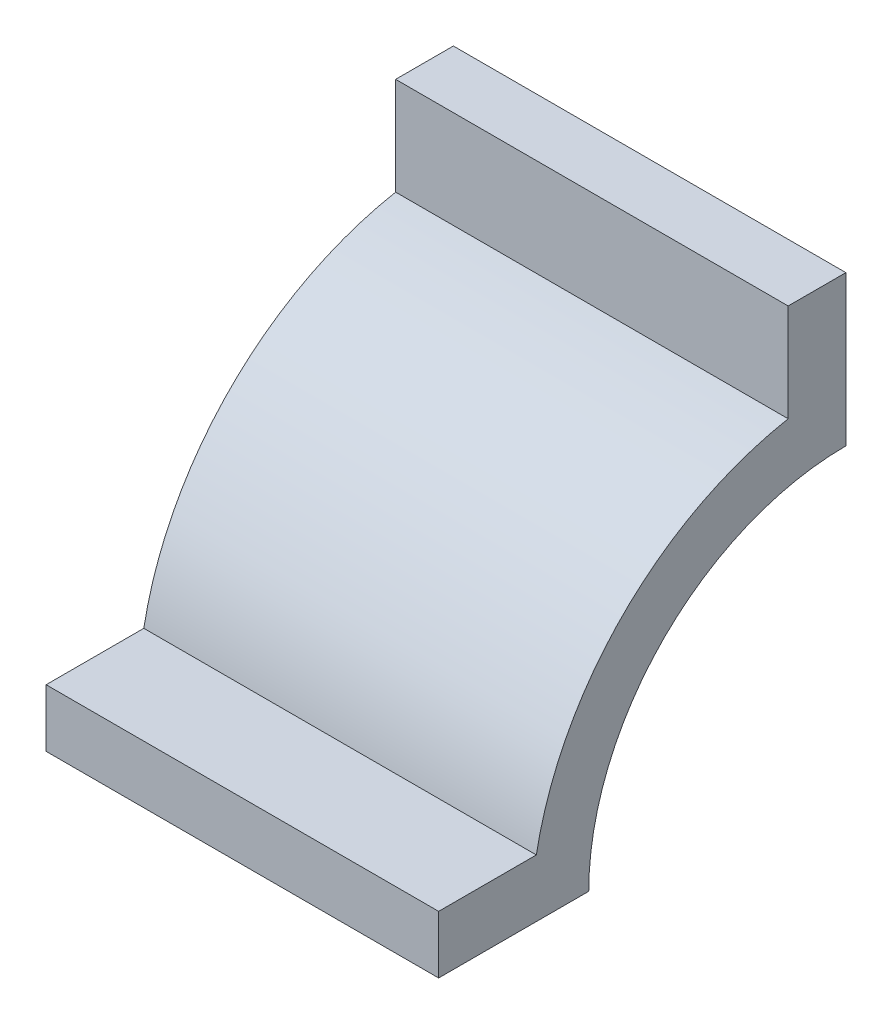
ISO-10303-21;
HEADER;
FILE_DESCRIPTION(('STEP AP214'),'2;1');
FILE_NAME('part.step','',(''),(''),'','','');
FILE_SCHEMA(('AUTOMOTIVE_DESIGN { 1 0 10303 214 1 1 1 1 }'));
ENDSEC;
DATA;
#1=APPLICATION_CONTEXT('core data for automotive mechanical design processes');
#2=APPLICATION_PROTOCOL_DEFINITION('international standard','automotive_design',2000,#1);
#3=PRODUCT_CONTEXT('',#1,'mechanical');
#4=PRODUCT('Part','Part','',(#3));
#5=PRODUCT_RELATED_PRODUCT_CATEGORY('part','',(#4));
#6=PRODUCT_DEFINITION_FORMATION('','',#4);
#7=PRODUCT_DEFINITION_CONTEXT('part definition',#1,'design');
#8=PRODUCT_DEFINITION('design','',#6,#7);
#9=PRODUCT_DEFINITION_SHAPE('','',#8);
#10=(LENGTH_UNIT() NAMED_UNIT(*) SI_UNIT(.MILLI.,.METRE.));
#11=(NAMED_UNIT(*) PLANE_ANGLE_UNIT() SI_UNIT($,.RADIAN.));
#12=(NAMED_UNIT(*) SI_UNIT($,.STERADIAN.) SOLID_ANGLE_UNIT());
#13=UNCERTAINTY_MEASURE_WITH_UNIT(LENGTH_MEASURE(1.E-05),#10,'distance_accuracy_value','');
#14=(GEOMETRIC_REPRESENTATION_CONTEXT(3) GLOBAL_UNCERTAINTY_ASSIGNED_CONTEXT((#13)) GLOBAL_UNIT_ASSIGNED_CONTEXT((#10,
#11,#12)) REPRESENTATION_CONTEXT('',''));
#15=CARTESIAN_POINT('',(0.,0.,0.));
#16=DIRECTION('',(0.,0.,1.));
#17=DIRECTION('',(1.,0.,0.));
#18=AXIS2_PLACEMENT_3D('',#15,#16,#17);
#19=CARTESIAN_POINT('',(34.,0.,0.));
#20=DIRECTION('',(-1.,0.,0.));
#21=DIRECTION('',(0.,0.,1.));
#22=AXIS2_PLACEMENT_3D('',#19,#20,#21);
#23=CYLINDRICAL_SURFACE('',#22,22.275);
#24=CARTESIAN_POINT('',(0.,0.,0.));
#25=DIRECTION('',(-1.,0.,0.));
#26=DIRECTION('',(0.,0.,1.));
#27=AXIS2_PLACEMENT_3D('',#24,#25,#26);
#28=CIRCLE('',#27,22.275);
#29=CARTESIAN_POINT('',(0.,0.,22.275));
#30=VERTEX_POINT('',#29);
#31=CARTESIAN_POINT('',(0.,22.275,0.));
#32=VERTEX_POINT('',#31);
#33=EDGE_CURVE('E135',#30,#32,#28,.T.);
#34=ORIENTED_EDGE('',*,*,#33,.T.);
#35=DIRECTION('',(-1.,0.,0.));
#36=VECTOR('',#35,1.);
#37=CARTESIAN_POINT('',(34.,22.275,0.));
#38=LINE('',#37,#36);
#39=CARTESIAN_POINT('',(34.,22.275,0.));
#40=VERTEX_POINT('',#39);
#41=EDGE_CURVE('E11',#40,#32,#38,.T.);
#42=ORIENTED_EDGE('',*,*,#41,.F.);
#43=CARTESIAN_POINT('',(34.,0.,0.));
#44=DIRECTION('',(-1.,0.,0.));
#45=DIRECTION('',(0.,0.,1.));
#46=AXIS2_PLACEMENT_3D('',#43,#44,#45);
#47=CIRCLE('',#46,22.275);
#48=CARTESIAN_POINT('',(34.,0.,22.275));
#49=VERTEX_POINT('',#48);
#50=EDGE_CURVE('E149',#49,#40,#47,.T.);
#51=ORIENTED_EDGE('',*,*,#50,.F.);
#52=DIRECTION('',(-1.,0.,0.));
#53=VECTOR('',#52,1.);
#54=CARTESIAN_POINT('',(34.,0.,22.275));
#55=LINE('',#54,#53);
#56=EDGE_CURVE('E131',#49,#30,#55,.T.);
#57=ORIENTED_EDGE('',*,*,#56,.T.);
#58=EDGE_LOOP('',(#34,#42,#51,#57));
#59=FACE_BOUND('',#58,.T.);
#60=ADVANCED_FACE('F39',(#59),#23,.F.);
#61=CARTESIAN_POINT('',(34.,22.275,0.));
#62=DIRECTION('',(0.,0.,1.));
#63=DIRECTION('',(1.,0.,0.));
#64=AXIS2_PLACEMENT_3D('',#61,#62,#63);
#65=PLANE('',#64);
#66=DIRECTION('',(0.,1.,0.));
#67=VECTOR('',#66,1.);
#68=CARTESIAN_POINT('',(0.,22.275,0.));
#69=LINE('',#68,#67);
#70=CARTESIAN_POINT('',(0.,35.275,0.));
#71=VERTEX_POINT('',#70);
#72=EDGE_CURVE('E138',#32,#71,#69,.T.);
#73=ORIENTED_EDGE('',*,*,#72,.T.);
#74=DIRECTION('',(-1.,0.,0.));
#75=VECTOR('',#74,1.);
#76=CARTESIAN_POINT('',(34.,35.275,0.));
#77=LINE('',#76,#75);
#78=CARTESIAN_POINT('',(34.,35.275,0.));
#79=VERTEX_POINT('',#78);
#80=EDGE_CURVE('E47',#79,#71,#77,.T.);
#81=ORIENTED_EDGE('',*,*,#80,.F.);
#82=DIRECTION('',(0.,1.,0.));
#83=VECTOR('',#82,1.);
#84=CARTESIAN_POINT('',(34.,22.275,0.));
#85=LINE('',#84,#83);
#86=EDGE_CURVE('E98',#40,#79,#85,.T.);
#87=ORIENTED_EDGE('',*,*,#86,.F.);
#88=ORIENTED_EDGE('',*,*,#41,.T.);
#89=EDGE_LOOP('',(#73,#81,#87,#88));
#90=FACE_BOUND('',#89,.T.);
#91=ADVANCED_FACE('F184',(#90),#65,.F.);
#92=CARTESIAN_POINT('',(34.,35.275,0.));
#93=DIRECTION('',(0.,-1.,0.));
#94=DIRECTION('',(0.,0.,-1.));
#95=AXIS2_PLACEMENT_3D('',#92,#93,#94);
#96=PLANE('',#95);
#97=DIRECTION('',(0.,0.,1.));
#98=VECTOR('',#97,1.);
#99=CARTESIAN_POINT('',(0.,35.275,0.));
#100=LINE('',#99,#98);
#101=CARTESIAN_POINT('',(0.,35.275,5.));
#102=VERTEX_POINT('',#101);
#103=EDGE_CURVE('E140',#71,#102,#100,.T.);
#104=ORIENTED_EDGE('',*,*,#103,.T.);
#105=DIRECTION('',(-1.,0.,0.));
#106=VECTOR('',#105,1.);
#107=CARTESIAN_POINT('',(34.,35.275,5.));
#108=LINE('',#107,#106);
#109=CARTESIAN_POINT('',(34.,35.275,5.));
#110=VERTEX_POINT('',#109);
#111=EDGE_CURVE('E156',#110,#102,#108,.T.);
#112=ORIENTED_EDGE('',*,*,#111,.F.);
#113=DIRECTION('',(0.,0.,1.));
#114=VECTOR('',#113,1.);
#115=CARTESIAN_POINT('',(34.,35.275,0.));
#116=LINE('',#115,#114);
#117=EDGE_CURVE('E164',#79,#110,#116,.T.);
#118=ORIENTED_EDGE('',*,*,#117,.F.);
#119=ORIENTED_EDGE('',*,*,#80,.T.);
#120=EDGE_LOOP('',(#104,#112,#118,#119));
#121=FACE_BOUND('',#120,.T.);
#122=ADVANCED_FACE('F162',(#121),#96,.F.);
#123=CARTESIAN_POINT('',(34.,35.275,5.));
#124=DIRECTION('',(0.,0.,-1.));
#125=DIRECTION('',(0.,1.,0.));
#126=AXIS2_PLACEMENT_3D('',#123,#124,#125);
#127=PLANE('',#126);
#128=DIRECTION('',(0.,-1.,0.));
#129=VECTOR('',#128,1.);
#130=CARTESIAN_POINT('',(0.,35.275,5.));
#131=LINE('',#130,#129);
#132=CARTESIAN_POINT('',(0.,26.8127884599868,5.));
#133=VERTEX_POINT('',#132);
#134=EDGE_CURVE('E142',#102,#133,#131,.T.);
#135=ORIENTED_EDGE('',*,*,#134,.T.);
#136=DIRECTION('',(-1.,0.,0.));
#137=VECTOR('',#136,1.);
#138=CARTESIAN_POINT('',(34.,26.8127884599868,5.));
#139=LINE('',#138,#137);
#140=CARTESIAN_POINT('',(34.,26.8127884599868,5.));
#141=VERTEX_POINT('',#140);
#142=EDGE_CURVE('E153',#141,#133,#139,.T.);
#143=ORIENTED_EDGE('',*,*,#142,.F.);
#144=DIRECTION('',(0.,-1.,0.));
#145=VECTOR('',#144,1.);
#146=CARTESIAN_POINT('',(34.,35.275,5.));
#147=LINE('',#146,#145);
#148=EDGE_CURVE('E176',#110,#141,#147,.T.);
#149=ORIENTED_EDGE('',*,*,#148,.F.);
#150=ORIENTED_EDGE('',*,*,#111,.T.);
#151=EDGE_LOOP('',(#135,#143,#149,#150));
#152=FACE_BOUND('',#151,.T.);
#153=ADVANCED_FACE('F172',(#152),#127,.F.);
#154=CARTESIAN_POINT('',(34.,0.,0.));
#155=DIRECTION('',(-1.,0.,0.));
#156=DIRECTION('',(0.,0.,1.));
#157=AXIS2_PLACEMENT_3D('',#154,#155,#156);
#158=CYLINDRICAL_SURFACE('',#157,27.275);
#159=CARTESIAN_POINT('',(0.,0.,0.));
#160=DIRECTION('',(1.,0.,0.));
#161=DIRECTION('',(0.,0.,-1.));
#162=AXIS2_PLACEMENT_3D('',#159,#160,#161);
#163=CIRCLE('',#162,27.275);
#164=CARTESIAN_POINT('',(0.,5.,26.8127884599868));
#165=VERTEX_POINT('',#164);
#166=EDGE_CURVE('E144',#133,#165,#163,.T.);
#167=ORIENTED_EDGE('',*,*,#166,.T.);
#168=DIRECTION('',(-1.,0.,0.));
#169=VECTOR('',#168,1.);
#170=CARTESIAN_POINT('',(34.,5.,26.8127884599868));
#171=LINE('',#170,#169);
#172=CARTESIAN_POINT('',(34.,5.,26.8127884599868));
#173=VERTEX_POINT('',#172);
#174=EDGE_CURVE('E126',#173,#165,#171,.T.);
#175=ORIENTED_EDGE('',*,*,#174,.F.);
#176=CARTESIAN_POINT('',(34.,0.,0.));
#177=DIRECTION('',(1.,0.,0.));
#178=DIRECTION('',(0.,0.,-1.));
#179=AXIS2_PLACEMENT_3D('',#176,#177,#178);
#180=CIRCLE('',#179,27.275);
#181=EDGE_CURVE('E117',#141,#173,#180,.T.);
#182=ORIENTED_EDGE('',*,*,#181,.F.);
#183=ORIENTED_EDGE('',*,*,#142,.T.);
#184=EDGE_LOOP('',(#167,#175,#182,#183));
#185=FACE_BOUND('',#184,.T.);
#186=ADVANCED_FACE('F175',(#185),#158,.T.);
#187=CARTESIAN_POINT('',(34.,5.,26.8127884599868));
#188=DIRECTION('',(0.,-1.,0.));
#189=DIRECTION('',(0.,0.,-1.));
#190=AXIS2_PLACEMENT_3D('',#187,#188,#189);
#191=PLANE('',#190);
#192=DIRECTION('',(0.,0.,1.));
#193=VECTOR('',#192,1.);
#194=CARTESIAN_POINT('',(0.,5.,26.8127884599868));
#195=LINE('',#194,#193);
#196=CARTESIAN_POINT('',(0.,5.,35.275));
#197=VERTEX_POINT('',#196);
#198=EDGE_CURVE('E125',#165,#197,#195,.T.);
#199=ORIENTED_EDGE('',*,*,#198,.T.);
#200=DIRECTION('',(-1.,0.,0.));
#201=VECTOR('',#200,1.);
#202=CARTESIAN_POINT('',(34.,5.,35.275));
#203=LINE('',#202,#201);
#204=CARTESIAN_POINT('',(34.,5.,35.275));
#205=VERTEX_POINT('',#204);
#206=EDGE_CURVE('E122',#205,#197,#203,.T.);
#207=ORIENTED_EDGE('',*,*,#206,.F.);
#208=DIRECTION('',(0.,0.,1.));
#209=VECTOR('',#208,1.);
#210=CARTESIAN_POINT('',(34.,5.,26.8127884599868));
#211=LINE('',#210,#209);
#212=EDGE_CURVE('E111',#173,#205,#211,.T.);
#213=ORIENTED_EDGE('',*,*,#212,.F.);
#214=ORIENTED_EDGE('',*,*,#174,.T.);
#215=EDGE_LOOP('',(#199,#207,#213,#214));
#216=FACE_BOUND('',#215,.T.);
#217=ADVANCED_FACE('F123',(#216),#191,.F.);
#218=CARTESIAN_POINT('',(34.,5.,35.275));
#219=DIRECTION('',(0.,0.,-1.));
#220=DIRECTION('',(-1.,0.,0.));
#221=AXIS2_PLACEMENT_3D('',#218,#219,#220);
#222=PLANE('',#221);
#223=DIRECTION('',(0.,-1.,0.));
#224=VECTOR('',#223,1.);
#225=CARTESIAN_POINT('',(0.,5.,35.275));
#226=LINE('',#225,#224);
#227=CARTESIAN_POINT('',(0.,0.,35.275));
#228=VERTEX_POINT('',#227);
#229=EDGE_CURVE('E84',#197,#228,#226,.T.);
#230=ORIENTED_EDGE('',*,*,#229,.T.);
#231=DIRECTION('',(-1.,0.,0.));
#232=VECTOR('',#231,1.);
#233=CARTESIAN_POINT('',(34.,0.,35.275));
#234=LINE('',#233,#232);
#235=CARTESIAN_POINT('',(34.,0.,35.275));
#236=VERTEX_POINT('',#235);
#237=EDGE_CURVE('E127',#236,#228,#234,.T.);
#238=ORIENTED_EDGE('',*,*,#237,.F.);
#239=DIRECTION('',(0.,-1.,0.));
#240=VECTOR('',#239,1.);
#241=CARTESIAN_POINT('',(34.,5.,35.275));
#242=LINE('',#241,#240);
#243=EDGE_CURVE('E115',#205,#236,#242,.T.);
#244=ORIENTED_EDGE('',*,*,#243,.F.);
#245=ORIENTED_EDGE('',*,*,#206,.T.);
#246=EDGE_LOOP('',(#230,#238,#244,#245));
#247=FACE_BOUND('',#246,.T.);
#248=ADVANCED_FACE('F129',(#247),#222,.F.);
#249=CARTESIAN_POINT('',(34.,0.,35.275));
#250=DIRECTION('',(0.,1.,0.));
#251=DIRECTION('',(0.,0.,1.));
#252=AXIS2_PLACEMENT_3D('',#249,#250,#251);
#253=PLANE('',#252);
#254=DIRECTION('',(0.,0.,-1.));
#255=VECTOR('',#254,1.);
#256=CARTESIAN_POINT('',(0.,0.,35.275));
#257=LINE('',#256,#255);
#258=EDGE_CURVE('E90',#228,#30,#257,.T.);
#259=ORIENTED_EDGE('',*,*,#258,.T.);
#260=ORIENTED_EDGE('',*,*,#56,.F.);
#261=DIRECTION('',(0.,0.,-1.));
#262=VECTOR('',#261,1.);
#263=CARTESIAN_POINT('',(34.,0.,35.275));
#264=LINE('',#263,#262);
#265=EDGE_CURVE('E55',#236,#49,#264,.T.);
#266=ORIENTED_EDGE('',*,*,#265,.F.);
#267=ORIENTED_EDGE('',*,*,#237,.T.);
#268=EDGE_LOOP('',(#259,#260,#266,#267));
#269=FACE_BOUND('',#268,.T.);
#270=ADVANCED_FACE('F200',(#269),#253,.F.);
#271=CARTESIAN_POINT('',(34.,0.,0.));
#272=DIRECTION('',(-1.,0.,0.));
#273=DIRECTION('',(0.,0.,1.));
#274=AXIS2_PLACEMENT_3D('',#271,#272,#273);
#275=PLANE('',#274);
#276=ORIENTED_EDGE('',*,*,#50,.T.);
#277=ORIENTED_EDGE('',*,*,#86,.T.);
#278=ORIENTED_EDGE('',*,*,#117,.T.);
#279=ORIENTED_EDGE('',*,*,#148,.T.);
#280=ORIENTED_EDGE('',*,*,#181,.T.);
#281=ORIENTED_EDGE('',*,*,#212,.T.);
#282=ORIENTED_EDGE('',*,*,#243,.T.);
#283=ORIENTED_EDGE('',*,*,#265,.T.);
#284=EDGE_LOOP('',(#276,#277,#278,#279,#280,#281,#282,#283));
#285=FACE_BOUND('',#284,.T.);
#286=ADVANCED_FACE('F113',(#285),#275,.F.);
#287=CARTESIAN_POINT('',(0.,0.,0.));
#288=DIRECTION('',(-1.,0.,0.));
#289=DIRECTION('',(0.,0.,1.));
#290=AXIS2_PLACEMENT_3D('',#287,#288,#289);
#291=PLANE('',#290);
#292=ORIENTED_EDGE('',*,*,#33,.F.);
#293=ORIENTED_EDGE('',*,*,#258,.F.);
#294=ORIENTED_EDGE('',*,*,#229,.F.);
#295=ORIENTED_EDGE('',*,*,#198,.F.);
#296=ORIENTED_EDGE('',*,*,#166,.F.);
#297=ORIENTED_EDGE('',*,*,#134,.F.);
#298=ORIENTED_EDGE('',*,*,#103,.F.);
#299=ORIENTED_EDGE('',*,*,#72,.F.);
#300=EDGE_LOOP('',(#292,#293,#294,#295,#296,#297,#298,#299));
#301=FACE_BOUND('',#300,.T.);
#302=ADVANCED_FACE('F168',(#301),#291,.T.);
#303=CLOSED_SHELL('',(#60,#91,#122,#153,#186,#217,#248,#270,#286,#302));
#304=MANIFOLD_SOLID_BREP('B2',#303);
#305=ADVANCED_BREP_SHAPE_REPRESENTATION('',(#18,#304),#14);
#306=SHAPE_DEFINITION_REPRESENTATION(#9,#305);
ENDSEC;
END-ISO-10303-21;
